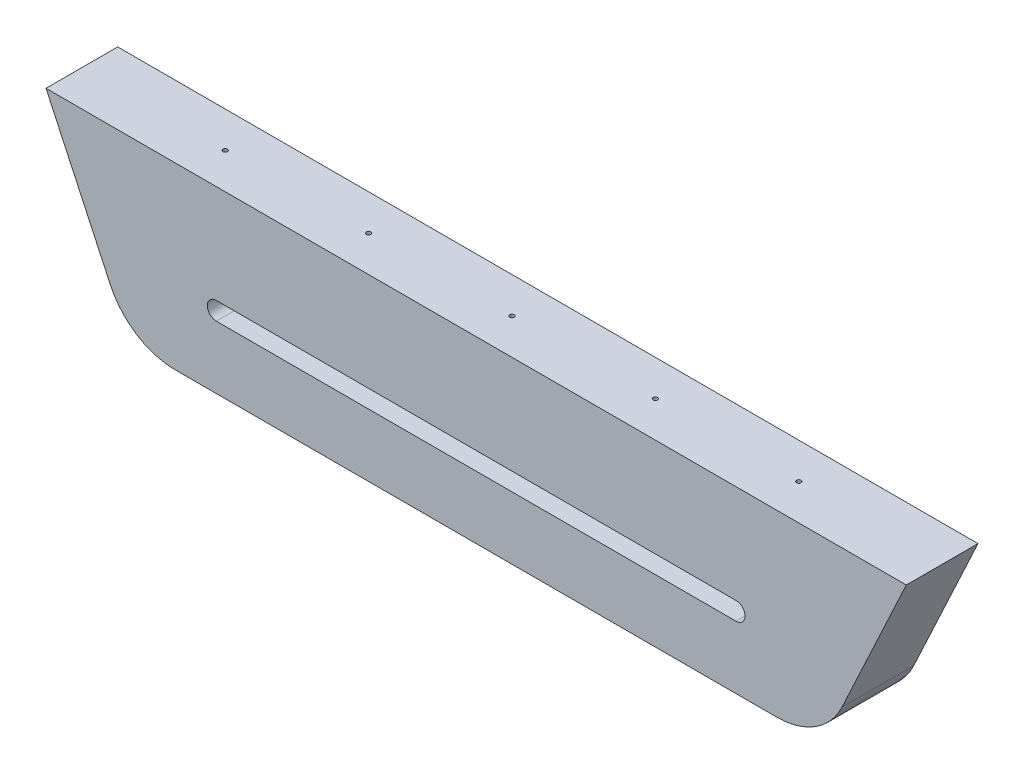
ISO-10303-21;
HEADER;
FILE_DESCRIPTION(('STEP AP214'),'2;1');
FILE_NAME('part.step','',(''),(''),'','','');
FILE_SCHEMA(('AUTOMOTIVE_DESIGN { 1 0 10303 214 1 1 1 1 }'));
ENDSEC;
DATA;
#1=APPLICATION_CONTEXT('core data for automotive mechanical design processes');
#2=APPLICATION_PROTOCOL_DEFINITION('international standard','automotive_design',2000,#1);
#3=PRODUCT_CONTEXT('',#1,'mechanical');
#4=PRODUCT('Part','Part','',(#3));
#5=PRODUCT_RELATED_PRODUCT_CATEGORY('part','',(#4));
#6=PRODUCT_DEFINITION_FORMATION('','',#4);
#7=PRODUCT_DEFINITION_CONTEXT('part definition',#1,'design');
#8=PRODUCT_DEFINITION('design','',#6,#7);
#9=PRODUCT_DEFINITION_SHAPE('','',#8);
#10=(LENGTH_UNIT() NAMED_UNIT(*) SI_UNIT(.MILLI.,.METRE.));
#11=(NAMED_UNIT(*) PLANE_ANGLE_UNIT() SI_UNIT($,.RADIAN.));
#12=(NAMED_UNIT(*) SI_UNIT($,.STERADIAN.) SOLID_ANGLE_UNIT());
#13=UNCERTAINTY_MEASURE_WITH_UNIT(LENGTH_MEASURE(1.E-05),#10,'distance_accuracy_value','');
#14=(GEOMETRIC_REPRESENTATION_CONTEXT(3) GLOBAL_UNCERTAINTY_ASSIGNED_CONTEXT((#13)) GLOBAL_UNIT_ASSIGNED_CONTEXT((#10,
#11,#12)) REPRESENTATION_CONTEXT('',''));
#15=CARTESIAN_POINT('',(0.,0.,0.));
#16=DIRECTION('',(0.,0.,1.));
#17=DIRECTION('',(1.,0.,0.));
#18=AXIS2_PLACEMENT_3D('',#15,#16,#17);
#19=CARTESIAN_POINT('',(-122.789463707157,-63.5,25.4));
#20=DIRECTION('',(0.906307787036648,0.422618261740704,0.));
#21=DIRECTION('',(-0.422618261740704,0.906307787036648,0.));
#22=AXIS2_PLACEMENT_3D('',#19,#20,#21);
#23=PLANE('',#22);
#24=DIRECTION('',(0.422618261740704,-0.906307787036648,0.));
#25=VECTOR('',#24,1.);
#26=CARTESIAN_POINT('',(-122.789463707157,-63.5,0.));
#27=LINE('',#26,#25);
#28=CARTESIAN_POINT('',(-152.4,0.,0.));
#29=VERTEX_POINT('',#28);
#30=CARTESIAN_POINT('',(-129.628096873378,-48.8345038482139,0.));
#31=VERTEX_POINT('',#30);
#32=EDGE_CURVE('E277',#29,#31,#27,.T.);
#33=ORIENTED_EDGE('',*,*,#32,.T.);
#34=DIRECTION('',(0.,0.,-1.));
#35=VECTOR('',#34,1.);
#36=CARTESIAN_POINT('',(-129.628096873378,-48.8345038482139,25.4));
#37=LINE('',#36,#35);
#38=CARTESIAN_POINT('',(-129.628096873378,-48.8345038482139,25.4));
#39=VERTEX_POINT('',#38);
#40=EDGE_CURVE('E312',#31,#39,#37,.F.);
#41=ORIENTED_EDGE('',*,*,#40,.T.);
#42=DIRECTION('',(0.422618261740704,-0.906307787036648,0.));
#43=VECTOR('',#42,1.);
#44=CARTESIAN_POINT('',(-122.789463707157,-63.5,25.4));
#45=LINE('',#44,#43);
#46=CARTESIAN_POINT('',(-152.4,0.,25.4));
#47=VERTEX_POINT('',#46);
#48=EDGE_CURVE('E278',#47,#39,#45,.T.);
#49=ORIENTED_EDGE('',*,*,#48,.F.);
#50=DIRECTION('',(0.,0.,-1.));
#51=VECTOR('',#50,1.);
#52=CARTESIAN_POINT('',(-152.4,0.,25.4));
#53=LINE('',#52,#51);
#54=EDGE_CURVE('E289',#47,#29,#53,.T.);
#55=ORIENTED_EDGE('',*,*,#54,.T.);
#56=EDGE_LOOP('',(#33,#41,#49,#55));
#57=FACE_BOUND('',#56,.T.);
#58=ADVANCED_FACE('F121',(#57),#23,.F.);
#59=CARTESIAN_POINT('',(122.789463707157,-63.5,25.4));
#60=DIRECTION('',(0.,1.,0.));
#61=DIRECTION('',(0.,0.,1.));
#62=AXIS2_PLACEMENT_3D('',#59,#60,#61);
#63=PLANE('',#62);
#64=DIRECTION('',(1.,0.,0.));
#65=VECTOR('',#64,1.);
#66=CARTESIAN_POINT('',(122.789463707157,-63.5,25.4));
#67=LINE('',#66,#65);
#68=CARTESIAN_POINT('',(-106.607879082647,-63.5,25.4));
#69=VERTEX_POINT('',#68);
#70=CARTESIAN_POINT('',(106.607879082647,-63.5,25.4));
#71=VERTEX_POINT('',#70);
#72=EDGE_CURVE('E281',#69,#71,#67,.T.);
#73=ORIENTED_EDGE('',*,*,#72,.F.);
#74=DIRECTION('',(0.,0.,-1.));
#75=VECTOR('',#74,1.);
#76=CARTESIAN_POINT('',(-106.607879082647,-63.5,25.4));
#77=LINE('',#76,#75);
#78=CARTESIAN_POINT('',(-106.607879082647,-63.5,0.));
#79=VERTEX_POINT('',#78);
#80=EDGE_CURVE('E305',#69,#79,#77,.T.);
#81=ORIENTED_EDGE('',*,*,#80,.T.);
#82=DIRECTION('',(1.,0.,0.));
#83=VECTOR('',#82,1.);
#84=CARTESIAN_POINT('',(122.789463707157,-63.5,0.));
#85=LINE('',#84,#83);
#86=CARTESIAN_POINT('',(106.607879082647,-63.5,0.));
#87=VERTEX_POINT('',#86);
#88=EDGE_CURVE('E292',#79,#87,#85,.T.);
#89=ORIENTED_EDGE('',*,*,#88,.T.);
#90=DIRECTION('',(0.,0.,-1.));
#91=VECTOR('',#90,1.);
#92=CARTESIAN_POINT('',(106.607879082647,-63.5,25.4));
#93=LINE('',#92,#91);
#94=EDGE_CURVE('E303',#87,#71,#93,.F.);
#95=ORIENTED_EDGE('',*,*,#94,.T.);
#96=EDGE_LOOP('',(#73,#81,#89,#95));
#97=FACE_BOUND('',#96,.T.);
#98=ADVANCED_FACE('F325',(#97),#63,.F.);
#99=CARTESIAN_POINT('',(152.4,0.,25.4));
#100=DIRECTION('',(-0.906307787036648,0.422618261740704,0.));
#101=DIRECTION('',(-0.422618261740704,-0.906307787036648,0.));
#102=AXIS2_PLACEMENT_3D('',#99,#100,#101);
#103=PLANE('',#102);
#104=DIRECTION('',(0.422618261740704,0.906307787036648,0.));
#105=VECTOR('',#104,1.);
#106=CARTESIAN_POINT('',(152.4,0.,25.4));
#107=LINE('',#106,#105);
#108=CARTESIAN_POINT('',(129.628096873378,-48.8345038482139,25.4));
#109=VERTEX_POINT('',#108);
#110=CARTESIAN_POINT('',(152.4,0.,25.4));
#111=VERTEX_POINT('',#110);
#112=EDGE_CURVE('E285',#109,#111,#107,.T.);
#113=ORIENTED_EDGE('',*,*,#112,.F.);
#114=DIRECTION('',(0.,0.,-1.));
#115=VECTOR('',#114,1.);
#116=CARTESIAN_POINT('',(129.628096873378,-48.8345038482139,25.4));
#117=LINE('',#116,#115);
#118=CARTESIAN_POINT('',(129.628096873378,-48.8345038482139,0.));
#119=VERTEX_POINT('',#118);
#120=EDGE_CURVE('E15',#109,#119,#117,.T.);
#121=ORIENTED_EDGE('',*,*,#120,.T.);
#122=DIRECTION('',(0.422618261740704,0.906307787036648,0.));
#123=VECTOR('',#122,1.);
#124=CARTESIAN_POINT('',(152.4,0.,0.));
#125=LINE('',#124,#123);
#126=CARTESIAN_POINT('',(152.4,0.,0.));
#127=VERTEX_POINT('',#126);
#128=EDGE_CURVE('E295',#119,#127,#125,.T.);
#129=ORIENTED_EDGE('',*,*,#128,.T.);
#130=DIRECTION('',(0.,0.,-1.));
#131=VECTOR('',#130,1.);
#132=CARTESIAN_POINT('',(152.4,0.,25.4));
#133=LINE('',#132,#131);
#134=EDGE_CURVE('E300',#111,#127,#133,.T.);
#135=ORIENTED_EDGE('',*,*,#134,.F.);
#136=EDGE_LOOP('',(#113,#121,#129,#135));
#137=FACE_BOUND('',#136,.T.);
#138=ADVANCED_FACE('F342',(#137),#103,.F.);
#139=CARTESIAN_POINT('',(-152.4,0.,25.4));
#140=DIRECTION('',(0.,-1.,0.));
#141=DIRECTION('',(0.,0.,-1.));
#142=AXIS2_PLACEMENT_3D('',#139,#140,#141);
#143=PLANE('',#142);
#144=CARTESIAN_POINT('',(-101.6,0.,12.7));
#145=DIRECTION('',(0.,1.,0.));
#146=DIRECTION('',(0.,0.,1.));
#147=AXIS2_PLACEMENT_3D('',#144,#145,#146);
#148=CIRCLE('',#147,0.793749999999996);
#149=CARTESIAN_POINT('',(-101.6,0.,13.49375));
#150=VERTEX_POINT('',#149);
#151=EDGE_CURVE('E222',#150,#150,#148,.T.);
#152=ORIENTED_EDGE('',*,*,#151,.F.);
#153=EDGE_LOOP('',(#152));
#154=FACE_BOUND('',#153,.T.);
#155=CARTESIAN_POINT('',(-50.8,0.,12.7));
#156=DIRECTION('',(0.,1.,0.));
#157=DIRECTION('',(0.,0.,1.));
#158=AXIS2_PLACEMENT_3D('',#155,#156,#157);
#159=CIRCLE('',#158,0.793749999999996);
#160=CARTESIAN_POINT('',(-50.8,0.,13.49375));
#161=VERTEX_POINT('',#160);
#162=EDGE_CURVE('E221',#161,#161,#159,.T.);
#163=ORIENTED_EDGE('',*,*,#162,.F.);
#164=EDGE_LOOP('',(#163));
#165=FACE_BOUND('',#164,.T.);
#166=CARTESIAN_POINT('',(0.,0.,12.7));
#167=DIRECTION('',(0.,1.,0.));
#168=DIRECTION('',(0.,0.,1.));
#169=AXIS2_PLACEMENT_3D('',#166,#167,#168);
#170=CIRCLE('',#169,0.793749999999994);
#171=CARTESIAN_POINT('',(0.,0.,13.49375));
#172=VERTEX_POINT('',#171);
#173=EDGE_CURVE('E232',#172,#172,#170,.T.);
#174=ORIENTED_EDGE('',*,*,#173,.F.);
#175=EDGE_LOOP('',(#174));
#176=FACE_BOUND('',#175,.T.);
#177=CARTESIAN_POINT('',(50.8,0.,12.7));
#178=DIRECTION('',(0.,1.,0.));
#179=DIRECTION('',(0.,0.,1.));
#180=AXIS2_PLACEMENT_3D('',#177,#178,#179);
#181=CIRCLE('',#180,0.793749999999996);
#182=CARTESIAN_POINT('',(50.8,0.,13.49375));
#183=VERTEX_POINT('',#182);
#184=EDGE_CURVE('E238',#183,#183,#181,.T.);
#185=ORIENTED_EDGE('',*,*,#184,.F.);
#186=EDGE_LOOP('',(#185));
#187=FACE_BOUND('',#186,.T.);
#188=CARTESIAN_POINT('',(101.6,0.,12.7));
#189=DIRECTION('',(0.,1.,0.));
#190=DIRECTION('',(0.,0.,1.));
#191=AXIS2_PLACEMENT_3D('',#188,#189,#190);
#192=CIRCLE('',#191,0.793749999999996);
#193=CARTESIAN_POINT('',(101.6,0.,13.49375));
#194=VERTEX_POINT('',#193);
#195=EDGE_CURVE('E244',#194,#194,#192,.T.);
#196=ORIENTED_EDGE('',*,*,#195,.F.);
#197=EDGE_LOOP('',(#196));
#198=FACE_BOUND('',#197,.T.);
#199=DIRECTION('',(-1.,0.,0.));
#200=VECTOR('',#199,1.);
#201=CARTESIAN_POINT('',(-152.4,0.,0.));
#202=LINE('',#201,#200);
#203=EDGE_CURVE('E282',#127,#29,#202,.T.);
#204=ORIENTED_EDGE('',*,*,#203,.T.);
#205=ORIENTED_EDGE('',*,*,#54,.F.);
#206=DIRECTION('',(-1.,0.,0.));
#207=VECTOR('',#206,1.);
#208=CARTESIAN_POINT('',(-152.4,0.,25.4));
#209=LINE('',#208,#207);
#210=EDGE_CURVE('E287',#111,#47,#209,.T.);
#211=ORIENTED_EDGE('',*,*,#210,.F.);
#212=ORIENTED_EDGE('',*,*,#134,.T.);
#213=EDGE_LOOP('',(#204,#205,#211,#212));
#214=FACE_BOUND('',#213,.T.);
#215=ADVANCED_FACE('F337',(#154,#165,#176,#187,#198,#214),#143,.F.);
#216=CARTESIAN_POINT('',(0.,0.,25.4));
#217=DIRECTION('',(0.,0.,-1.));
#218=DIRECTION('',(-1.,0.,0.));
#219=AXIS2_PLACEMENT_3D('',#216,#217,#218);
#220=PLANE('',#219);
#221=CARTESIAN_POINT('',(92.075,-38.1,25.4));
#222=DIRECTION('',(0.,0.,1.));
#223=DIRECTION('',(1.,0.,0.));
#224=AXIS2_PLACEMENT_3D('',#221,#222,#223);
#225=CIRCLE('',#224,3.17499999999999);
#226=CARTESIAN_POINT('',(92.075,-41.275,25.4));
#227=VERTEX_POINT('',#226);
#228=CARTESIAN_POINT('',(92.075,-34.925,25.4));
#229=VERTEX_POINT('',#228);
#230=EDGE_CURVE('E266',#227,#229,#225,.T.);
#231=ORIENTED_EDGE('',*,*,#230,.F.);
#232=DIRECTION('',(1.,0.,0.));
#233=VECTOR('',#232,1.);
#234=CARTESIAN_POINT('',(-92.075,-41.2750000000001,25.4));
#235=LINE('',#234,#233);
#236=CARTESIAN_POINT('',(-92.075,-41.275,25.4));
#237=VERTEX_POINT('',#236);
#238=EDGE_CURVE('E250',#237,#227,#235,.T.);
#239=ORIENTED_EDGE('',*,*,#238,.F.);
#240=CARTESIAN_POINT('',(-92.075,-38.1,25.4));
#241=DIRECTION('',(0.,0.,1.));
#242=DIRECTION('',(1.,0.,0.));
#243=AXIS2_PLACEMENT_3D('',#240,#241,#242);
#244=CIRCLE('',#243,3.17499999999999);
#245=CARTESIAN_POINT('',(-92.075,-34.9250000000001,25.4));
#246=VERTEX_POINT('',#245);
#247=EDGE_CURVE('E260',#246,#237,#244,.T.);
#248=ORIENTED_EDGE('',*,*,#247,.F.);
#249=DIRECTION('',(1.,0.,0.));
#250=VECTOR('',#249,1.);
#251=CARTESIAN_POINT('',(-92.075,-34.9250000000001,25.4));
#252=LINE('',#251,#250);
#253=EDGE_CURVE('E257',#246,#229,#252,.T.);
#254=ORIENTED_EDGE('',*,*,#253,.T.);
#255=EDGE_LOOP('',(#231,#239,#248,#254));
#256=FACE_BOUND('',#255,.T.);
#257=ORIENTED_EDGE('',*,*,#48,.T.);
#258=CARTESIAN_POINT('',(-106.607879082647,-38.1,25.4));
#259=DIRECTION('',(0.,0.,-1.));
#260=DIRECTION('',(-1.,0.,0.));
#261=AXIS2_PLACEMENT_3D('',#258,#259,#260);
#262=CIRCLE('',#261,25.4);
#263=EDGE_CURVE('E129',#39,#69,#262,.F.);
#264=ORIENTED_EDGE('',*,*,#263,.T.);
#265=ORIENTED_EDGE('',*,*,#72,.T.);
#266=CARTESIAN_POINT('',(106.607879082647,-38.1,25.4));
#267=DIRECTION('',(0.,0.,-1.));
#268=DIRECTION('',(-1.,0.,0.));
#269=AXIS2_PLACEMENT_3D('',#266,#267,#268);
#270=CIRCLE('',#269,25.4);
#271=EDGE_CURVE('E314',#71,#109,#270,.F.);
#272=ORIENTED_EDGE('',*,*,#271,.T.);
#273=ORIENTED_EDGE('',*,*,#112,.T.);
#274=ORIENTED_EDGE('',*,*,#210,.T.);
#275=EDGE_LOOP('',(#257,#264,#265,#272,#273,#274));
#276=FACE_BOUND('',#275,.T.);
#277=ADVANCED_FACE('F318',(#256,#276),#220,.F.);
#278=CARTESIAN_POINT('',(0.,0.,0.));
#279=DIRECTION('',(0.,0.,-1.));
#280=DIRECTION('',(-1.,0.,0.));
#281=AXIS2_PLACEMENT_3D('',#278,#279,#280);
#282=PLANE('',#281);
#283=CARTESIAN_POINT('',(92.075,-38.1,0.));
#284=DIRECTION('',(0.,0.,1.));
#285=DIRECTION('',(1.,0.,0.));
#286=AXIS2_PLACEMENT_3D('',#283,#284,#285);
#287=CIRCLE('',#286,3.17499999999999);
#288=CARTESIAN_POINT('',(92.075,-41.275,0.));
#289=VERTEX_POINT('',#288);
#290=CARTESIAN_POINT('',(92.075,-34.925,0.));
#291=VERTEX_POINT('',#290);
#292=EDGE_CURVE('E269',#289,#291,#287,.T.);
#293=ORIENTED_EDGE('',*,*,#292,.T.);
#294=DIRECTION('',(1.,0.,0.));
#295=VECTOR('',#294,1.);
#296=CARTESIAN_POINT('',(-92.075,-34.9250000000001,0.));
#297=LINE('',#296,#295);
#298=CARTESIAN_POINT('',(-92.075,-34.9250000000001,0.));
#299=VERTEX_POINT('',#298);
#300=EDGE_CURVE('E255',#299,#291,#297,.T.);
#301=ORIENTED_EDGE('',*,*,#300,.F.);
#302=CARTESIAN_POINT('',(-92.075,-38.1,0.));
#303=DIRECTION('',(0.,0.,1.));
#304=DIRECTION('',(1.,0.,0.));
#305=AXIS2_PLACEMENT_3D('',#302,#303,#304);
#306=CIRCLE('',#305,3.17499999999999);
#307=CARTESIAN_POINT('',(-92.075,-41.275,0.));
#308=VERTEX_POINT('',#307);
#309=EDGE_CURVE('E141',#299,#308,#306,.T.);
#310=ORIENTED_EDGE('',*,*,#309,.T.);
#311=DIRECTION('',(1.,0.,0.));
#312=VECTOR('',#311,1.);
#313=CARTESIAN_POINT('',(-92.075,-41.275,0.));
#314=LINE('',#313,#312);
#315=EDGE_CURVE('E252',#308,#289,#314,.T.);
#316=ORIENTED_EDGE('',*,*,#315,.T.);
#317=EDGE_LOOP('',(#293,#301,#310,#316));
#318=FACE_BOUND('',#317,.T.);
#319=ORIENTED_EDGE('',*,*,#88,.F.);
#320=CARTESIAN_POINT('',(-106.607879082647,-38.1,0.));
#321=DIRECTION('',(0.,0.,-1.));
#322=DIRECTION('',(-1.,0.,0.));
#323=AXIS2_PLACEMENT_3D('',#320,#321,#322);
#324=CIRCLE('',#323,25.4);
#325=EDGE_CURVE('E310',#79,#31,#324,.T.);
#326=ORIENTED_EDGE('',*,*,#325,.T.);
#327=ORIENTED_EDGE('',*,*,#32,.F.);
#328=ORIENTED_EDGE('',*,*,#203,.F.);
#329=ORIENTED_EDGE('',*,*,#128,.F.);
#330=CARTESIAN_POINT('',(106.607879082647,-38.1,0.));
#331=DIRECTION('',(0.,0.,-1.));
#332=DIRECTION('',(-1.,0.,0.));
#333=AXIS2_PLACEMENT_3D('',#330,#331,#332);
#334=CIRCLE('',#333,25.4);
#335=EDGE_CURVE('E308',#119,#87,#334,.T.);
#336=ORIENTED_EDGE('',*,*,#335,.T.);
#337=EDGE_LOOP('',(#319,#326,#327,#328,#329,#336));
#338=FACE_BOUND('',#337,.T.);
#339=ADVANCED_FACE('F331',(#318,#338),#282,.T.);
#340=CARTESIAN_POINT('',(-106.607879082647,-38.1,25.4));
#341=DIRECTION('',(0.,0.,-1.));
#342=DIRECTION('',(-1.,0.,0.));
#343=AXIS2_PLACEMENT_3D('',#340,#341,#342);
#344=CYLINDRICAL_SURFACE('',#343,25.4);
#345=ORIENTED_EDGE('',*,*,#263,.F.);
#346=ORIENTED_EDGE('',*,*,#40,.F.);
#347=ORIENTED_EDGE('',*,*,#325,.F.);
#348=ORIENTED_EDGE('',*,*,#80,.F.);
#349=EDGE_LOOP('',(#345,#346,#347,#348));
#350=FACE_BOUND('',#349,.T.);
#351=ADVANCED_FACE('F328',(#350),#344,.T.);
#352=CARTESIAN_POINT('',(106.607879082647,-38.1,25.4));
#353=DIRECTION('',(0.,0.,-1.));
#354=DIRECTION('',(-1.,0.,0.));
#355=AXIS2_PLACEMENT_3D('',#352,#353,#354);
#356=CYLINDRICAL_SURFACE('',#355,25.4);
#357=ORIENTED_EDGE('',*,*,#271,.F.);
#358=ORIENTED_EDGE('',*,*,#94,.F.);
#359=ORIENTED_EDGE('',*,*,#335,.F.);
#360=ORIENTED_EDGE('',*,*,#120,.F.);
#361=EDGE_LOOP('',(#357,#358,#359,#360));
#362=FACE_BOUND('',#361,.T.);
#363=ADVANCED_FACE('F123',(#362),#356,.T.);
#364=CARTESIAN_POINT('',(92.075,-38.1,25.4));
#365=DIRECTION('',(0.,0.,1.));
#366=DIRECTION('',(1.,0.,0.));
#367=AXIS2_PLACEMENT_3D('',#364,#365,#366);
#368=CYLINDRICAL_SURFACE('',#367,3.17499999999999);
#369=ORIENTED_EDGE('',*,*,#292,.F.);
#370=DIRECTION('',(0.,0.,1.));
#371=VECTOR('',#370,1.);
#372=CARTESIAN_POINT('',(92.075,-41.275,25.4));
#373=LINE('',#372,#371);
#374=EDGE_CURVE('E274',#227,#289,#373,.F.);
#375=ORIENTED_EDGE('',*,*,#374,.F.);
#376=ORIENTED_EDGE('',*,*,#230,.T.);
#377=DIRECTION('',(0.,0.,1.));
#378=VECTOR('',#377,1.);
#379=CARTESIAN_POINT('',(92.075,-34.925,25.4));
#380=LINE('',#379,#378);
#381=EDGE_CURVE('E272',#291,#229,#380,.T.);
#382=ORIENTED_EDGE('',*,*,#381,.F.);
#383=EDGE_LOOP('',(#369,#375,#376,#382));
#384=FACE_BOUND('',#383,.T.);
#385=ADVANCED_FACE('F346',(#384),#368,.F.);
#386=CARTESIAN_POINT('',(-92.075,-38.1,25.4));
#387=DIRECTION('',(0.,0.,1.));
#388=DIRECTION('',(1.,0.,0.));
#389=AXIS2_PLACEMENT_3D('',#386,#387,#388);
#390=CYLINDRICAL_SURFACE('',#389,3.17499999999999);
#391=ORIENTED_EDGE('',*,*,#247,.T.);
#392=DIRECTION('',(0.,0.,1.));
#393=VECTOR('',#392,1.);
#394=CARTESIAN_POINT('',(-92.075,-41.275,25.4));
#395=LINE('',#394,#393);
#396=EDGE_CURVE('E263',#308,#237,#395,.T.);
#397=ORIENTED_EDGE('',*,*,#396,.F.);
#398=ORIENTED_EDGE('',*,*,#309,.F.);
#399=DIRECTION('',(0.,0.,1.));
#400=VECTOR('',#399,1.);
#401=CARTESIAN_POINT('',(-92.075,-34.9250000000001,25.4));
#402=LINE('',#401,#400);
#403=EDGE_CURVE('E136',#246,#299,#402,.F.);
#404=ORIENTED_EDGE('',*,*,#403,.F.);
#405=EDGE_LOOP('',(#391,#397,#398,#404));
#406=FACE_BOUND('',#405,.T.);
#407=ADVANCED_FACE('F351',(#406),#390,.F.);
#408=CARTESIAN_POINT('',(-92.075,-34.9250000000001,25.4));
#409=DIRECTION('',(0.,1.,0.));
#410=DIRECTION('',(-1.,0.,0.));
#411=AXIS2_PLACEMENT_3D('',#408,#409,#410);
#412=PLANE('',#411);
#413=ORIENTED_EDGE('',*,*,#381,.T.);
#414=ORIENTED_EDGE('',*,*,#253,.F.);
#415=ORIENTED_EDGE('',*,*,#403,.T.);
#416=ORIENTED_EDGE('',*,*,#300,.T.);
#417=EDGE_LOOP('',(#413,#414,#415,#416));
#418=FACE_BOUND('',#417,.T.);
#419=ADVANCED_FACE('F374',(#418),#412,.F.);
#420=CARTESIAN_POINT('',(-92.075,-41.275,25.4));
#421=DIRECTION('',(0.,-1.,0.));
#422=DIRECTION('',(1.,0.,0.));
#423=AXIS2_PLACEMENT_3D('',#420,#421,#422);
#424=PLANE('',#423);
#425=ORIENTED_EDGE('',*,*,#374,.T.);
#426=ORIENTED_EDGE('',*,*,#315,.F.);
#427=ORIENTED_EDGE('',*,*,#396,.T.);
#428=ORIENTED_EDGE('',*,*,#238,.T.);
#429=EDGE_LOOP('',(#425,#426,#427,#428));
#430=FACE_BOUND('',#429,.T.);
#431=ADVANCED_FACE('F377',(#430),#424,.F.);
#432=CARTESIAN_POINT('',(101.6,-12.7,12.7));
#433=DIRECTION('',(0.,1.,0.));
#434=DIRECTION('',(0.,0.,1.));
#435=AXIS2_PLACEMENT_3D('',#432,#433,#434);
#436=CONICAL_SURFACE('',#435,0.793749999999996,1.02974425867666);
#437=CARTESIAN_POINT('',(101.6,-13.1769331163531,12.7));
#438=VERTEX_POINT('',#437);
#439=VERTEX_LOOP('',#438);
#440=FACE_BOUND('',#439,.T.);
#441=CARTESIAN_POINT('',(101.6,-12.7,12.7));
#442=DIRECTION('',(0.,1.,0.));
#443=DIRECTION('',(0.,0.,1.));
#444=AXIS2_PLACEMENT_3D('',#441,#442,#443);
#445=CIRCLE('',#444,0.793749999999996);
#446=CARTESIAN_POINT('',(101.6,-12.7,13.49375));
#447=VERTEX_POINT('',#446);
#448=EDGE_CURVE('E247',#447,#447,#445,.T.);
#449=ORIENTED_EDGE('',*,*,#448,.T.);
#450=EDGE_LOOP('',(#449));
#451=FACE_BOUND('',#450,.T.);
#452=ADVANCED_FACE('F381',(#440,#451),#436,.F.);
#453=CARTESIAN_POINT('',(101.6,0.,12.7));
#454=DIRECTION('',(0.,1.,0.));
#455=DIRECTION('',(0.,0.,1.));
#456=AXIS2_PLACEMENT_3D('',#453,#454,#455);
#457=CYLINDRICAL_SURFACE('',#456,0.793749999999996);
#458=ORIENTED_EDGE('',*,*,#448,.F.);
#459=EDGE_LOOP('',(#458));
#460=FACE_BOUND('',#459,.T.);
#461=ORIENTED_EDGE('',*,*,#195,.T.);
#462=EDGE_LOOP('',(#461));
#463=FACE_BOUND('',#462,.T.);
#464=ADVANCED_FACE('F385',(#460,#463),#457,.F.);
#465=CARTESIAN_POINT('',(50.8,-12.7,12.7));
#466=DIRECTION('',(0.,1.,0.));
#467=DIRECTION('',(0.,0.,1.));
#468=AXIS2_PLACEMENT_3D('',#465,#466,#467);
#469=CONICAL_SURFACE('',#468,0.793749999999989,1.02974425867665);
#470=CARTESIAN_POINT('',(50.8,-13.1769331163531,12.7));
#471=VERTEX_POINT('',#470);
#472=VERTEX_LOOP('',#471);
#473=FACE_BOUND('',#472,.T.);
#474=CARTESIAN_POINT('',(50.8,-12.7,12.7));
#475=DIRECTION('',(0.,1.,0.));
#476=DIRECTION('',(0.,0.,1.));
#477=AXIS2_PLACEMENT_3D('',#474,#475,#476);
#478=CIRCLE('',#477,0.793749999999989);
#479=CARTESIAN_POINT('',(50.8,-12.7,13.49375));
#480=VERTEX_POINT('',#479);
#481=EDGE_CURVE('E241',#480,#480,#478,.T.);
#482=ORIENTED_EDGE('',*,*,#481,.T.);
#483=EDGE_LOOP('',(#482));
#484=FACE_BOUND('',#483,.T.);
#485=ADVANCED_FACE('F389',(#473,#484),#469,.F.);
#486=CARTESIAN_POINT('',(50.8,0.,12.7));
#487=DIRECTION('',(0.,1.,0.));
#488=DIRECTION('',(0.,0.,1.));
#489=AXIS2_PLACEMENT_3D('',#486,#487,#488);
#490=CYLINDRICAL_SURFACE('',#489,0.793749999999992);
#491=ORIENTED_EDGE('',*,*,#481,.F.);
#492=EDGE_LOOP('',(#491));
#493=FACE_BOUND('',#492,.T.);
#494=ORIENTED_EDGE('',*,*,#184,.T.);
#495=EDGE_LOOP('',(#494));
#496=FACE_BOUND('',#495,.T.);
#497=ADVANCED_FACE('F393',(#493,#496),#490,.F.);
#498=CARTESIAN_POINT('',(0.,-12.7,12.7));
#499=DIRECTION('',(0.,1.,0.));
#500=DIRECTION('',(0.,0.,1.));
#501=AXIS2_PLACEMENT_3D('',#498,#499,#500);
#502=CONICAL_SURFACE('',#501,0.793749999999992,1.02974425867665);
#503=CARTESIAN_POINT('',(0.,-13.1769331163531,12.7));
#504=VERTEX_POINT('',#503);
#505=VERTEX_LOOP('',#504);
#506=FACE_BOUND('',#505,.T.);
#507=CARTESIAN_POINT('',(0.,-12.7,12.7));
#508=DIRECTION('',(0.,1.,0.));
#509=DIRECTION('',(0.,0.,1.));
#510=AXIS2_PLACEMENT_3D('',#507,#508,#509);
#511=CIRCLE('',#510,0.793749999999992);
#512=CARTESIAN_POINT('',(0.,-12.7,13.49375));
#513=VERTEX_POINT('',#512);
#514=EDGE_CURVE('E235',#513,#513,#511,.T.);
#515=ORIENTED_EDGE('',*,*,#514,.T.);
#516=EDGE_LOOP('',(#515));
#517=FACE_BOUND('',#516,.T.);
#518=ADVANCED_FACE('F397',(#506,#517),#502,.F.);
#519=CARTESIAN_POINT('',(0.,0.,12.7));
#520=DIRECTION('',(0.,1.,0.));
#521=DIRECTION('',(0.,0.,1.));
#522=AXIS2_PLACEMENT_3D('',#519,#520,#521);
#523=CYLINDRICAL_SURFACE('',#522,0.793749999999993);
#524=ORIENTED_EDGE('',*,*,#514,.F.);
#525=EDGE_LOOP('',(#524));
#526=FACE_BOUND('',#525,.T.);
#527=ORIENTED_EDGE('',*,*,#173,.T.);
#528=EDGE_LOOP('',(#527));
#529=FACE_BOUND('',#528,.T.);
#530=ADVANCED_FACE('F401',(#526,#529),#523,.F.);
#531=CARTESIAN_POINT('',(-50.8,-12.7,12.7));
#532=DIRECTION('',(0.,1.,0.));
#533=DIRECTION('',(0.,0.,1.));
#534=AXIS2_PLACEMENT_3D('',#531,#532,#533);
#535=CONICAL_SURFACE('',#534,0.793749999999989,1.02974425867665);
#536=CARTESIAN_POINT('',(-50.8,-13.1769331163531,12.7));
#537=VERTEX_POINT('',#536);
#538=VERTEX_LOOP('',#537);
#539=FACE_BOUND('',#538,.T.);
#540=CARTESIAN_POINT('',(-50.8,-12.7,12.7));
#541=DIRECTION('',(0.,1.,0.));
#542=DIRECTION('',(0.,0.,1.));
#543=AXIS2_PLACEMENT_3D('',#540,#541,#542);
#544=CIRCLE('',#543,0.793749999999989);
#545=CARTESIAN_POINT('',(-50.8,-12.7,13.49375));
#546=VERTEX_POINT('',#545);
#547=EDGE_CURVE('E225',#546,#546,#544,.T.);
#548=ORIENTED_EDGE('',*,*,#547,.T.);
#549=EDGE_LOOP('',(#548));
#550=FACE_BOUND('',#549,.T.);
#551=ADVANCED_FACE('F405',(#539,#550),#535,.F.);
#552=CARTESIAN_POINT('',(-50.8,0.,12.7));
#553=DIRECTION('',(0.,1.,0.));
#554=DIRECTION('',(0.,0.,1.));
#555=AXIS2_PLACEMENT_3D('',#552,#553,#554);
#556=CYLINDRICAL_SURFACE('',#555,0.793749999999992);
#557=ORIENTED_EDGE('',*,*,#547,.F.);
#558=EDGE_LOOP('',(#557));
#559=FACE_BOUND('',#558,.T.);
#560=ORIENTED_EDGE('',*,*,#162,.T.);
#561=EDGE_LOOP('',(#560));
#562=FACE_BOUND('',#561,.T.);
#563=ADVANCED_FACE('F215',(#559,#562),#556,.F.);
#564=CARTESIAN_POINT('',(-101.6,-12.7,12.7));
#565=DIRECTION('',(0.,1.,0.));
#566=DIRECTION('',(0.,0.,1.));
#567=AXIS2_PLACEMENT_3D('',#564,#565,#566);
#568=CONICAL_SURFACE('',#567,0.793749999999996,1.02974425867666);
#569=CARTESIAN_POINT('',(-101.6,-13.1769331163531,12.7));
#570=VERTEX_POINT('',#569);
#571=VERTEX_LOOP('',#570);
#572=FACE_BOUND('',#571,.T.);
#573=CARTESIAN_POINT('',(-101.6,-12.7,12.7));
#574=DIRECTION('',(0.,1.,0.));
#575=DIRECTION('',(0.,0.,1.));
#576=AXIS2_PLACEMENT_3D('',#573,#574,#575);
#577=CIRCLE('',#576,0.793749999999996);
#578=CARTESIAN_POINT('',(-101.6,-12.7,13.49375));
#579=VERTEX_POINT('',#578);
#580=EDGE_CURVE('E219',#579,#579,#577,.T.);
#581=ORIENTED_EDGE('',*,*,#580,.T.);
#582=EDGE_LOOP('',(#581));
#583=FACE_BOUND('',#582,.T.);
#584=ADVANCED_FACE('F211',(#572,#583),#568,.F.);
#585=CARTESIAN_POINT('',(-101.6,0.,12.7));
#586=DIRECTION('',(0.,1.,0.));
#587=DIRECTION('',(0.,0.,1.));
#588=AXIS2_PLACEMENT_3D('',#585,#586,#587);
#589=CYLINDRICAL_SURFACE('',#588,0.793749999999996);
#590=ORIENTED_EDGE('',*,*,#580,.F.);
#591=EDGE_LOOP('',(#590));
#592=FACE_BOUND('',#591,.T.);
#593=ORIENTED_EDGE('',*,*,#151,.T.);
#594=EDGE_LOOP('',(#593));
#595=FACE_BOUND('',#594,.T.);
#596=ADVANCED_FACE('F214',(#592,#595),#589,.F.);
#597=CLOSED_SHELL('',(#58,#98,#138,#215,#277,#339,#351,#363,#385,#407,#419,#431,#452,#464,#485,
#497,#518,#530,#551,#563,#584,#596));
#598=MANIFOLD_SOLID_BREP('B2',#597);
#599=ADVANCED_BREP_SHAPE_REPRESENTATION('',(#18,#598),#14);
#600=SHAPE_DEFINITION_REPRESENTATION(#9,#599);
ENDSEC;
END-ISO-10303-21;
